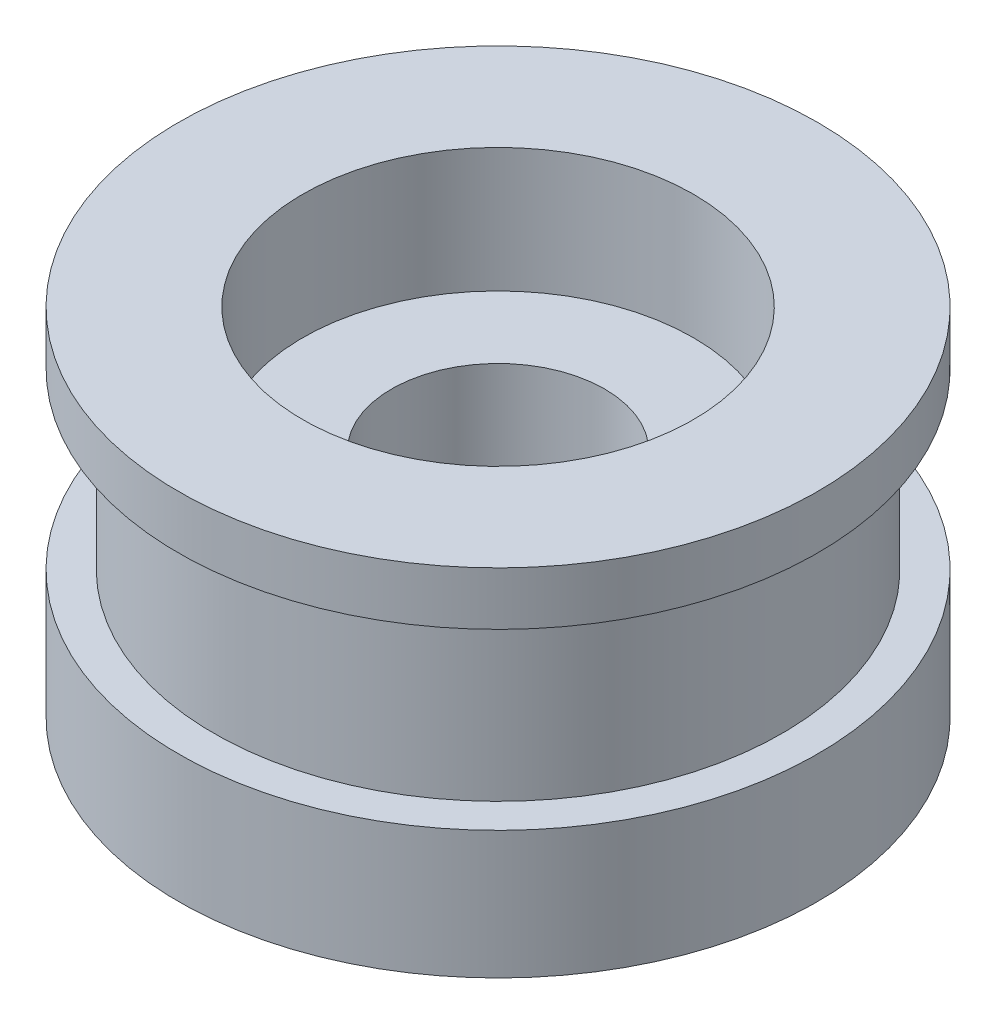
ISO-10303-21;
HEADER;
FILE_DESCRIPTION(('STEP AP214'),'2;1');
FILE_NAME('part.step','',(''),(''),'','','');
FILE_SCHEMA(('AUTOMOTIVE_DESIGN { 1 0 10303 214 1 1 1 1 }'));
ENDSEC;
DATA;
#1=APPLICATION_CONTEXT('core data for automotive mechanical design processes');
#2=APPLICATION_PROTOCOL_DEFINITION('international standard','automotive_design',2000,#1);
#3=PRODUCT_CONTEXT('',#1,'mechanical');
#4=PRODUCT('Part','Part','',(#3));
#5=PRODUCT_RELATED_PRODUCT_CATEGORY('part','',(#4));
#6=PRODUCT_DEFINITION_FORMATION('','',#4);
#7=PRODUCT_DEFINITION_CONTEXT('part definition',#1,'design');
#8=PRODUCT_DEFINITION('design','',#6,#7);
#9=PRODUCT_DEFINITION_SHAPE('','',#8);
#10=(LENGTH_UNIT() NAMED_UNIT(*) SI_UNIT(.MILLI.,.METRE.));
#11=(NAMED_UNIT(*) PLANE_ANGLE_UNIT() SI_UNIT($,.RADIAN.));
#12=(NAMED_UNIT(*) SI_UNIT($,.STERADIAN.) SOLID_ANGLE_UNIT());
#13=UNCERTAINTY_MEASURE_WITH_UNIT(LENGTH_MEASURE(1.E-05),#10,'distance_accuracy_value','');
#14=(GEOMETRIC_REPRESENTATION_CONTEXT(3) GLOBAL_UNCERTAINTY_ASSIGNED_CONTEXT((#13)) GLOBAL_UNIT_ASSIGNED_CONTEXT((#10,
#11,#12)) REPRESENTATION_CONTEXT('',''));
#15=CARTESIAN_POINT('',(0.,0.,0.));
#16=DIRECTION('',(0.,0.,1.));
#17=DIRECTION('',(1.,0.,0.));
#18=AXIS2_PLACEMENT_3D('',#15,#16,#17);
#19=CARTESIAN_POINT('',(4.5,0.,0.));
#20=DIRECTION('',(0.,-1.,0.));
#21=DIRECTION('',(0.,0.,-1.));
#22=AXIS2_PLACEMENT_3D('',#19,#20,#21);
#23=PLANE('',#22);
#24=CARTESIAN_POINT('',(0.,0.,0.));
#25=DIRECTION('',(0.,-1.,0.));
#26=DIRECTION('',(0.,0.,-1.));
#27=AXIS2_PLACEMENT_3D('',#24,#25,#26);
#28=CIRCLE('',#27,4.5);
#29=CARTESIAN_POINT('',(0.,0.,-4.5));
#30=VERTEX_POINT('',#29);
#31=EDGE_CURVE('E80',#30,#30,#28,.T.);
#32=ORIENTED_EDGE('',*,*,#31,.T.);
#33=EDGE_LOOP('',(#32));
#34=FACE_BOUND('',#33,.T.);
#35=CARTESIAN_POINT('',(0.,0.,0.));
#36=DIRECTION('',(0.,-1.,0.));
#37=DIRECTION('',(0.,0.,-1.));
#38=AXIS2_PLACEMENT_3D('',#35,#36,#37);
#39=CIRCLE('',#38,1.5);
#40=CARTESIAN_POINT('',(0.,0.,-1.5));
#41=VERTEX_POINT('',#40);
#42=EDGE_CURVE('E10',#41,#41,#39,.T.);
#43=ORIENTED_EDGE('',*,*,#42,.F.);
#44=EDGE_LOOP('',(#43));
#45=FACE_BOUND('',#44,.T.);
#46=ADVANCED_FACE('F37',(#34,#45),#23,.T.);
#47=CARTESIAN_POINT('',(0.,-50.,0.));
#48=DIRECTION('',(0.,-1.,0.));
#49=DIRECTION('',(0.,0.,-1.));
#50=AXIS2_PLACEMENT_3D('',#47,#48,#49);
#51=CYLINDRICAL_SURFACE('',#50,1.5);
#52=ORIENTED_EDGE('',*,*,#42,.T.);
#53=EDGE_LOOP('',(#52));
#54=FACE_BOUND('',#53,.T.);
#55=CARTESIAN_POINT('',(0.,3.25,0.));
#56=DIRECTION('',(0.,-1.,0.));
#57=DIRECTION('',(0.,0.,-1.));
#58=AXIS2_PLACEMENT_3D('',#55,#56,#57);
#59=CIRCLE('',#58,1.5);
#60=CARTESIAN_POINT('',(0.,3.25,-1.5));
#61=VERTEX_POINT('',#60);
#62=EDGE_CURVE('E44',#61,#61,#59,.T.);
#63=ORIENTED_EDGE('',*,*,#62,.F.);
#64=EDGE_LOOP('',(#63));
#65=FACE_BOUND('',#64,.T.);
#66=ADVANCED_FACE('F99',(#54,#65),#51,.F.);
#67=CARTESIAN_POINT('',(1.5,3.25,0.));
#68=DIRECTION('',(0.,1.,0.));
#69=DIRECTION('',(0.,0.,1.));
#70=AXIS2_PLACEMENT_3D('',#67,#68,#69);
#71=PLANE('',#70);
#72=ORIENTED_EDGE('',*,*,#62,.T.);
#73=EDGE_LOOP('',(#72));
#74=FACE_BOUND('',#73,.T.);
#75=CARTESIAN_POINT('',(0.,3.25,0.));
#76=DIRECTION('',(0.,-1.,0.));
#77=DIRECTION('',(0.,0.,-1.));
#78=AXIS2_PLACEMENT_3D('',#75,#76,#77);
#79=CIRCLE('',#78,2.75);
#80=CARTESIAN_POINT('',(0.,3.25,-2.75));
#81=VERTEX_POINT('',#80);
#82=EDGE_CURVE('E49',#81,#81,#79,.T.);
#83=ORIENTED_EDGE('',*,*,#82,.F.);
#84=EDGE_LOOP('',(#83));
#85=FACE_BOUND('',#84,.T.);
#86=ADVANCED_FACE('F103',(#74,#85),#71,.T.);
#87=CARTESIAN_POINT('',(0.,-50.,0.));
#88=DIRECTION('',(0.,-1.,0.));
#89=DIRECTION('',(0.,0.,-1.));
#90=AXIS2_PLACEMENT_3D('',#87,#88,#89);
#91=CYLINDRICAL_SURFACE('',#90,2.75);
#92=ORIENTED_EDGE('',*,*,#82,.T.);
#93=EDGE_LOOP('',(#92));
#94=FACE_BOUND('',#93,.T.);
#95=CARTESIAN_POINT('',(0.,5.,0.));
#96=DIRECTION('',(0.,-1.,0.));
#97=DIRECTION('',(0.,0.,-1.));
#98=AXIS2_PLACEMENT_3D('',#95,#96,#97);
#99=CIRCLE('',#98,2.75);
#100=CARTESIAN_POINT('',(0.,5.,-2.75));
#101=VERTEX_POINT('',#100);
#102=EDGE_CURVE('E54',#101,#101,#99,.T.);
#103=ORIENTED_EDGE('',*,*,#102,.F.);
#104=EDGE_LOOP('',(#103));
#105=FACE_BOUND('',#104,.T.);
#106=ADVANCED_FACE('F107',(#94,#105),#91,.F.);
#107=CARTESIAN_POINT('',(2.75,5.,0.));
#108=DIRECTION('',(0.,1.,0.));
#109=DIRECTION('',(0.,0.,1.));
#110=AXIS2_PLACEMENT_3D('',#107,#108,#109);
#111=PLANE('',#110);
#112=ORIENTED_EDGE('',*,*,#102,.T.);
#113=EDGE_LOOP('',(#112));
#114=FACE_BOUND('',#113,.T.);
#115=CARTESIAN_POINT('',(0.,5.,0.));
#116=DIRECTION('',(0.,-1.,0.));
#117=DIRECTION('',(0.,0.,-1.));
#118=AXIS2_PLACEMENT_3D('',#115,#116,#117);
#119=CIRCLE('',#118,4.5);
#120=CARTESIAN_POINT('',(0.,5.,-4.5));
#121=VERTEX_POINT('',#120);
#122=EDGE_CURVE('E60',#121,#121,#119,.T.);
#123=ORIENTED_EDGE('',*,*,#122,.F.);
#124=EDGE_LOOP('',(#123));
#125=FACE_BOUND('',#124,.T.);
#126=ADVANCED_FACE('F113',(#114,#125),#111,.T.);
#127=CARTESIAN_POINT('',(0.,-50.,0.));
#128=DIRECTION('',(0.,-1.,0.));
#129=DIRECTION('',(0.,0.,-1.));
#130=AXIS2_PLACEMENT_3D('',#127,#128,#129);
#131=CYLINDRICAL_SURFACE('',#130,4.5);
#132=ORIENTED_EDGE('',*,*,#122,.T.);
#133=EDGE_LOOP('',(#132));
#134=FACE_BOUND('',#133,.T.);
#135=CARTESIAN_POINT('',(0.,4.25,0.));
#136=DIRECTION('',(0.,-1.,0.));
#137=DIRECTION('',(0.,0.,-1.));
#138=AXIS2_PLACEMENT_3D('',#135,#136,#137);
#139=CIRCLE('',#138,4.5);
#140=CARTESIAN_POINT('',(0.,4.25,-4.5));
#141=VERTEX_POINT('',#140);
#142=EDGE_CURVE('E64',#141,#141,#139,.T.);
#143=ORIENTED_EDGE('',*,*,#142,.F.);
#144=EDGE_LOOP('',(#143));
#145=FACE_BOUND('',#144,.T.);
#146=ADVANCED_FACE('F117',(#134,#145),#131,.T.);
#147=CARTESIAN_POINT('',(4.5,4.25,0.));
#148=DIRECTION('',(0.,-1.,0.));
#149=DIRECTION('',(0.,0.,-1.));
#150=AXIS2_PLACEMENT_3D('',#147,#148,#149);
#151=PLANE('',#150);
#152=ORIENTED_EDGE('',*,*,#142,.T.);
#153=EDGE_LOOP('',(#152));
#154=FACE_BOUND('',#153,.T.);
#155=CARTESIAN_POINT('',(0.,4.25,0.));
#156=DIRECTION('',(0.,-1.,0.));
#157=DIRECTION('',(0.,0.,-1.));
#158=AXIS2_PLACEMENT_3D('',#155,#156,#157);
#159=CIRCLE('',#158,4.);
#160=CARTESIAN_POINT('',(0.,4.25,-4.));
#161=VERTEX_POINT('',#160);
#162=EDGE_CURVE('E68',#161,#161,#159,.T.);
#163=ORIENTED_EDGE('',*,*,#162,.F.);
#164=EDGE_LOOP('',(#163));
#165=FACE_BOUND('',#164,.T.);
#166=ADVANCED_FACE('F121',(#154,#165),#151,.T.);
#167=CARTESIAN_POINT('',(0.,-50.,0.));
#168=DIRECTION('',(0.,-1.,0.));
#169=DIRECTION('',(0.,0.,-1.));
#170=AXIS2_PLACEMENT_3D('',#167,#168,#169);
#171=CYLINDRICAL_SURFACE('',#170,4.);
#172=ORIENTED_EDGE('',*,*,#162,.T.);
#173=EDGE_LOOP('',(#172));
#174=FACE_BOUND('',#173,.T.);
#175=CARTESIAN_POINT('',(0.,1.8,0.));
#176=DIRECTION('',(0.,-1.,0.));
#177=DIRECTION('',(0.,0.,-1.));
#178=AXIS2_PLACEMENT_3D('',#175,#176,#177);
#179=CIRCLE('',#178,4.);
#180=CARTESIAN_POINT('',(0.,1.8,-4.));
#181=VERTEX_POINT('',#180);
#182=EDGE_CURVE('E72',#181,#181,#179,.T.);
#183=ORIENTED_EDGE('',*,*,#182,.F.);
#184=EDGE_LOOP('',(#183));
#185=FACE_BOUND('',#184,.T.);
#186=ADVANCED_FACE('F95',(#174,#185),#171,.T.);
#187=CARTESIAN_POINT('',(4.,1.8,0.));
#188=DIRECTION('',(0.,1.,0.));
#189=DIRECTION('',(0.,0.,1.));
#190=AXIS2_PLACEMENT_3D('',#187,#188,#189);
#191=PLANE('',#190);
#192=ORIENTED_EDGE('',*,*,#182,.T.);
#193=EDGE_LOOP('',(#192));
#194=FACE_BOUND('',#193,.T.);
#195=CARTESIAN_POINT('',(0.,1.8,0.));
#196=DIRECTION('',(0.,-1.,0.));
#197=DIRECTION('',(0.,0.,-1.));
#198=AXIS2_PLACEMENT_3D('',#195,#196,#197);
#199=CIRCLE('',#198,4.5);
#200=CARTESIAN_POINT('',(0.,1.8,-4.5));
#201=VERTEX_POINT('',#200);
#202=EDGE_CURVE('E76',#201,#201,#199,.T.);
#203=ORIENTED_EDGE('',*,*,#202,.F.);
#204=EDGE_LOOP('',(#203));
#205=FACE_BOUND('',#204,.T.);
#206=ADVANCED_FACE('F89',(#194,#205),#191,.T.);
#207=CARTESIAN_POINT('',(0.,-50.,0.));
#208=DIRECTION('',(0.,-1.,0.));
#209=DIRECTION('',(0.,0.,-1.));
#210=AXIS2_PLACEMENT_3D('',#207,#208,#209);
#211=CYLINDRICAL_SURFACE('',#210,4.5);
#212=ORIENTED_EDGE('',*,*,#202,.T.);
#213=EDGE_LOOP('',(#212));
#214=FACE_BOUND('',#213,.T.);
#215=ORIENTED_EDGE('',*,*,#31,.F.);
#216=EDGE_LOOP('',(#215));
#217=FACE_BOUND('',#216,.T.);
#218=ADVANCED_FACE('F87',(#214,#217),#211,.T.);
#219=CLOSED_SHELL('',(#46,#66,#86,#106,#126,#146,#166,#186,#206,#218));
#220=MANIFOLD_SOLID_BREP('B2',#219);
#221=ADVANCED_BREP_SHAPE_REPRESENTATION('',(#18,#220),#14);
#222=SHAPE_DEFINITION_REPRESENTATION(#9,#221);
ENDSEC;
END-ISO-10303-21;
